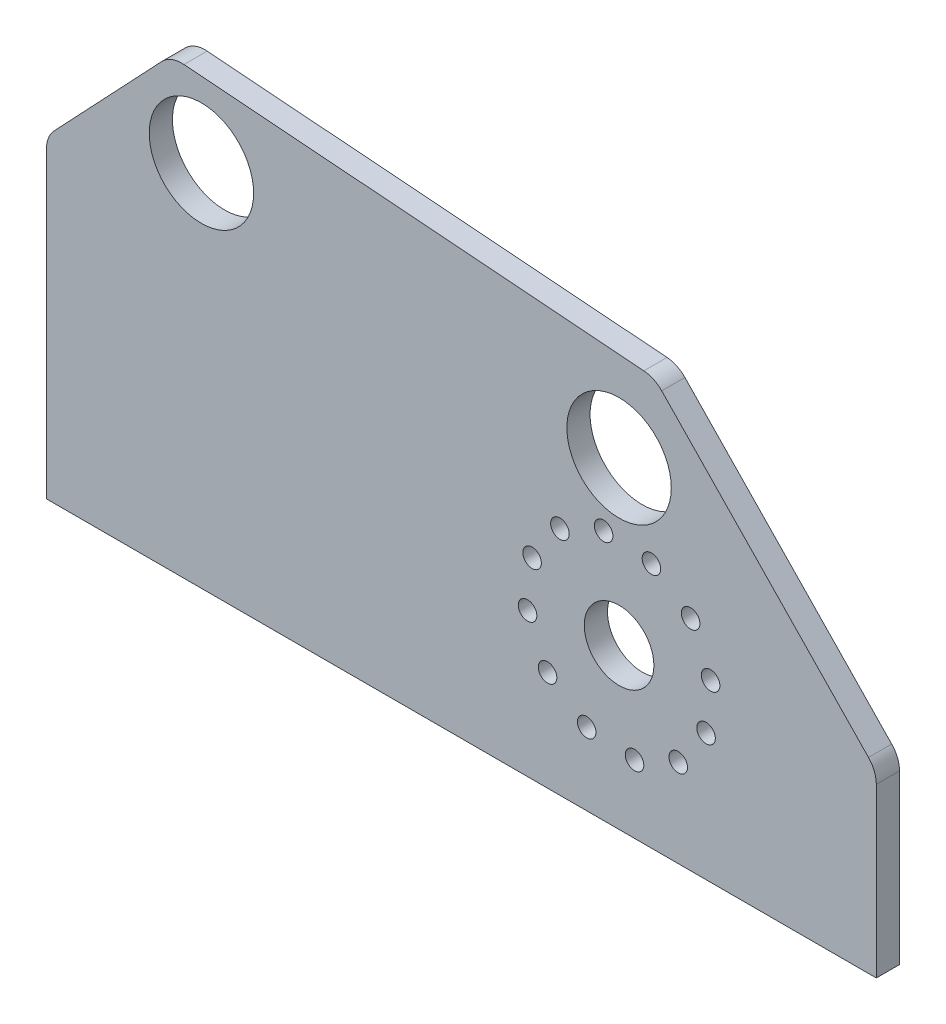
ISO-10303-21;
HEADER;
FILE_DESCRIPTION(('STEP AP214'),'2;1');
FILE_NAME('part.step','',(''),(''),'','','');
FILE_SCHEMA(('AUTOMOTIVE_DESIGN { 1 0 10303 214 1 1 1 1 }'));
ENDSEC;
DATA;
#1=APPLICATION_CONTEXT('core data for automotive mechanical design processes');
#2=APPLICATION_PROTOCOL_DEFINITION('international standard','automotive_design',2000,#1);
#3=PRODUCT_CONTEXT('',#1,'mechanical');
#4=PRODUCT('Part','Part','',(#3));
#5=PRODUCT_RELATED_PRODUCT_CATEGORY('part','',(#4));
#6=PRODUCT_DEFINITION_FORMATION('','',#4);
#7=PRODUCT_DEFINITION_CONTEXT('part definition',#1,'design');
#8=PRODUCT_DEFINITION('design','',#6,#7);
#9=PRODUCT_DEFINITION_SHAPE('','',#8);
#10=(LENGTH_UNIT() NAMED_UNIT(*) SI_UNIT(.MILLI.,.METRE.));
#11=(NAMED_UNIT(*) PLANE_ANGLE_UNIT() SI_UNIT($,.RADIAN.));
#12=(NAMED_UNIT(*) SI_UNIT($,.STERADIAN.) SOLID_ANGLE_UNIT());
#13=UNCERTAINTY_MEASURE_WITH_UNIT(LENGTH_MEASURE(1.E-05),#10,'distance_accuracy_value','');
#14=(GEOMETRIC_REPRESENTATION_CONTEXT(3) GLOBAL_UNCERTAINTY_ASSIGNED_CONTEXT((#13)) GLOBAL_UNIT_ASSIGNED_CONTEXT((#10,
#11,#12)) REPRESENTATION_CONTEXT('',''));
#15=CARTESIAN_POINT('',(0.,0.,0.));
#16=DIRECTION('',(0.,0.,1.));
#17=DIRECTION('',(1.,0.,0.));
#18=AXIS2_PLACEMENT_3D('',#15,#16,#17);
#19=CARTESIAN_POINT('',(-103.195672983194,204.440813465871,3.175));
#20=DIRECTION('',(0.,0.,-1.));
#21=DIRECTION('',(-1.,0.,0.));
#22=AXIS2_PLACEMENT_3D('',#19,#20,#21);
#23=CYLINDRICAL_SURFACE('',#22,2.54000000000001);
#24=CARTESIAN_POINT('',(-103.195672983194,204.440813465871,0.));
#25=DIRECTION('',(0.,0.,1.));
#26=DIRECTION('',(1.,0.,0.));
#27=AXIS2_PLACEMENT_3D('',#24,#25,#26);
#28=CIRCLE('',#27,2.54000000000001);
#29=CARTESIAN_POINT('',(-104.492793364608,202.256991422728,0.));
#30=VERTEX_POINT('',#29);
#31=CARTESIAN_POINT('',(-100.657320969105,204.532295991912,0.));
#32=VERTEX_POINT('',#31);
#33=EDGE_CURVE('E209',#30,#32,#28,.T.);
#34=ORIENTED_EDGE('',*,*,#33,.F.);
#35=DIRECTION('',(0.,0.,-1.));
#36=VECTOR('',#35,1.);
#37=CARTESIAN_POINT('',(-104.492793364608,202.256991422728,3.175));
#38=LINE('',#37,#36);
#39=CARTESIAN_POINT('',(-104.492793364608,202.256991422728,-3.175));
#40=VERTEX_POINT('',#39);
#41=EDGE_CURVE('E84',#30,#40,#38,.T.);
#42=ORIENTED_EDGE('',*,*,#41,.T.);
#43=CARTESIAN_POINT('',(-103.195672983194,204.440813465871,-3.175));
#44=DIRECTION('',(0.,0.,1.));
#45=DIRECTION('',(1.,0.,0.));
#46=AXIS2_PLACEMENT_3D('',#43,#44,#45);
#47=CIRCLE('',#46,2.54000000000001);
#48=CARTESIAN_POINT('',(-100.657320969105,204.532295991912,-3.175));
#49=VERTEX_POINT('',#48);
#50=EDGE_CURVE('E221',#40,#49,#47,.T.);
#51=ORIENTED_EDGE('',*,*,#50,.T.);
#52=DIRECTION('',(0.,0.,-1.));
#53=VECTOR('',#52,1.);
#54=CARTESIAN_POINT('',(-100.657320969105,204.532295991912,3.175));
#55=LINE('',#54,#53);
#56=EDGE_CURVE('E200',#32,#49,#55,.T.);
#57=ORIENTED_EDGE('',*,*,#56,.F.);
#58=EDGE_LOOP('',(#34,#42,#51,#57));
#59=FACE_BOUND('',#58,.T.);
#60=ADVANCED_FACE('F80',(#59),#23,.T.);
#61=CARTESIAN_POINT('',(0.,0.,3.175));
#62=DIRECTION('',(0.,0.,1.));
#63=DIRECTION('',(1.,0.,0.));
#64=AXIS2_PLACEMENT_3D('',#61,#62,#63);
#65=PLANE('',#64);
#66=CARTESIAN_POINT('',(-127.,198.12,3.175));
#67=DIRECTION('',(0.,0.,1.));
#68=DIRECTION('',(1.,0.,0.));
#69=AXIS2_PLACEMENT_3D('',#66,#67,#68);
#70=CIRCLE('',#69,9.52499999999999);
#71=CARTESIAN_POINT('',(-117.475,198.12,3.175));
#72=VERTEX_POINT('',#71);
#73=EDGE_CURVE('E305',#72,#72,#70,.T.);
#74=ORIENTED_EDGE('',*,*,#73,.F.);
#75=EDGE_LOOP('',(#74));
#76=FACE_BOUND('',#75,.T.);
#77=CARTESIAN_POINT('',(-118.139186534134,221.924327016808,3.175));
#78=DIRECTION('',(0.,0.,1.));
#79=DIRECTION('',(1.,0.,0.));
#80=AXIS2_PLACEMENT_3D('',#77,#78,#79);
#81=CIRCLE('',#80,2.54000000000006);
#82=CARTESIAN_POINT('',(-115.599186534134,221.924327016808,3.175));
#83=VERTEX_POINT('',#82);
#84=EDGE_CURVE('E356',#83,#83,#81,.T.);
#85=ORIENTED_EDGE('',*,*,#84,.F.);
#86=EDGE_LOOP('',(#85));
#87=FACE_BOUND('',#86,.T.);
#88=CARTESIAN_POINT('',(-107.424146931961,214.304745183615,3.175));
#89=DIRECTION('',(0.,0.,1.));
#90=DIRECTION('',(1.,0.,0.));
#91=AXIS2_PLACEMENT_3D('',#88,#89,#90);
#92=CIRCLE('',#91,2.54000000000001);
#93=CARTESIAN_POINT('',(-104.884146931961,214.304745183615,3.175));
#94=VERTEX_POINT('',#93);
#95=EDGE_CURVE('E348',#94,#94,#92,.T.);
#96=ORIENTED_EDGE('',*,*,#95,.F.);
#97=EDGE_LOOP('',(#96));
#98=FACE_BOUND('',#97,.T.);
#99=CARTESIAN_POINT('',(-103.195672983192,189.259186534134,3.175));
#100=DIRECTION('',(0.,0.,1.));
#101=DIRECTION('',(1.,0.,0.));
#102=AXIS2_PLACEMENT_3D('',#99,#100,#101);
#103=CIRCLE('',#102,2.54000000000001);
#104=CARTESIAN_POINT('',(-100.655672983192,189.259186534134,3.175));
#105=VERTEX_POINT('',#104);
#106=EDGE_CURVE('E347',#105,#105,#103,.T.);
#107=ORIENTED_EDGE('',*,*,#106,.F.);
#108=EDGE_LOOP('',(#107));
#109=FACE_BOUND('',#108,.T.);
#110=CARTESIAN_POINT('',(-110.815254816385,178.544146931961,3.175));
#111=DIRECTION('',(0.,0.,1.));
#112=DIRECTION('',(1.,0.,0.));
#113=AXIS2_PLACEMENT_3D('',#110,#111,#112);
#114=CIRCLE('',#113,2.53999999999998);
#115=CARTESIAN_POINT('',(-108.275254816385,178.544146931961,3.175));
#116=VERTEX_POINT('',#115);
#117=EDGE_CURVE('E353',#116,#116,#114,.T.);
#118=ORIENTED_EDGE('',*,*,#117,.F.);
#119=EDGE_LOOP('',(#118));
#120=FACE_BOUND('',#119,.T.);
#121=CARTESIAN_POINT('',(-122.771526051231,173.074441350519,3.175));
#122=DIRECTION('',(0.,0.,1.));
#123=DIRECTION('',(1.,0.,0.));
#124=AXIS2_PLACEMENT_3D('',#121,#122,#123);
#125=CIRCLE('',#124,2.53999999999998);
#126=CARTESIAN_POINT('',(-120.231526051231,173.074441350519,3.175));
#127=VERTEX_POINT('',#126);
#128=EDGE_CURVE('E363',#127,#127,#125,.T.);
#129=ORIENTED_EDGE('',*,*,#128,.F.);
#130=EDGE_LOOP('',(#129));
#131=FACE_BOUND('',#130,.T.);
#132=CARTESIAN_POINT('',(-241.3,255.27,3.175));
#133=DIRECTION('',(0.,0.,1.));
#134=DIRECTION('',(1.,0.,0.));
#135=AXIS2_PLACEMENT_3D('',#132,#133,#134);
#136=CIRCLE('',#135,14.2875);
#137=CARTESIAN_POINT('',(-227.0125,255.27,3.175));
#138=VERTEX_POINT('',#137);
#139=EDGE_CURVE('E367',#138,#138,#136,.T.);
#140=ORIENTED_EDGE('',*,*,#139,.F.);
#141=EDGE_LOOP('',(#140));
#142=FACE_BOUND('',#141,.T.);
#143=CARTESIAN_POINT('',(-127.,242.57,3.175));
#144=DIRECTION('',(0.,0.,1.));
#145=DIRECTION('',(1.,0.,0.));
#146=AXIS2_PLACEMENT_3D('',#143,#144,#145);
#147=CIRCLE('',#146,14.2875);
#148=CARTESIAN_POINT('',(-112.7125,242.57,3.175));
#149=VERTEX_POINT('',#148);
#150=EDGE_CURVE('E371',#149,#149,#147,.T.);
#151=ORIENTED_EDGE('',*,*,#150,.F.);
#152=EDGE_LOOP('',(#151));
#153=FACE_BOUND('',#152,.T.);
#154=CARTESIAN_POINT('',(-135.860813465866,174.315672983192,3.175));
#155=DIRECTION('',(0.,0.,1.));
#156=DIRECTION('',(1.,0.,0.));
#157=AXIS2_PLACEMENT_3D('',#154,#155,#156);
#158=CIRCLE('',#157,2.54000000000001);
#159=CARTESIAN_POINT('',(-133.320813465866,174.315672983192,3.175));
#160=VERTEX_POINT('',#159);
#161=EDGE_CURVE('E375',#160,#160,#158,.T.);
#162=ORIENTED_EDGE('',*,*,#161,.F.);
#163=EDGE_LOOP('',(#162));
#164=FACE_BOUND('',#163,.T.);
#165=CARTESIAN_POINT('',(-146.575853068039,181.935254816385,3.175));
#166=DIRECTION('',(0.,0.,1.));
#167=DIRECTION('',(1.,0.,0.));
#168=AXIS2_PLACEMENT_3D('',#165,#166,#167);
#169=CIRCLE('',#168,2.53999999999998);
#170=CARTESIAN_POINT('',(-144.035853068039,181.935254816385,3.175));
#171=VERTEX_POINT('',#170);
#172=EDGE_CURVE('E379',#171,#171,#169,.T.);
#173=ORIENTED_EDGE('',*,*,#172,.F.);
#174=EDGE_LOOP('',(#173));
#175=FACE_BOUND('',#174,.T.);
#176=CARTESIAN_POINT('',(-152.045558649481,193.891526051231,3.175));
#177=DIRECTION('',(0.,0.,1.));
#178=DIRECTION('',(1.,0.,0.));
#179=AXIS2_PLACEMENT_3D('',#176,#177,#178);
#180=CIRCLE('',#179,2.54000000000001);
#181=CARTESIAN_POINT('',(-149.505558649481,193.891526051231,3.175));
#182=VERTEX_POINT('',#181);
#183=EDGE_CURVE('E383',#182,#182,#180,.T.);
#184=ORIENTED_EDGE('',*,*,#183,.F.);
#185=EDGE_LOOP('',(#184));
#186=FACE_BOUND('',#185,.T.);
#187=CARTESIAN_POINT('',(-150.804327016808,206.980813465866,3.175));
#188=DIRECTION('',(0.,0.,1.));
#189=DIRECTION('',(1.,0.,0.));
#190=AXIS2_PLACEMENT_3D('',#187,#188,#189);
#191=CIRCLE('',#190,2.53999999999998);
#192=CARTESIAN_POINT('',(-148.264327016808,206.980813465866,3.175));
#193=VERTEX_POINT('',#192);
#194=EDGE_CURVE('E387',#193,#193,#191,.T.);
#195=ORIENTED_EDGE('',*,*,#194,.F.);
#196=EDGE_LOOP('',(#195));
#197=FACE_BOUND('',#196,.T.);
#198=CARTESIAN_POINT('',(-143.184745183615,217.695853068039,3.175));
#199=DIRECTION('',(0.,0.,1.));
#200=DIRECTION('',(1.,0.,0.));
#201=AXIS2_PLACEMENT_3D('',#198,#199,#200);
#202=CIRCLE('',#201,2.53999999999998);
#203=CARTESIAN_POINT('',(-140.644745183615,217.695853068039,3.175));
#204=VERTEX_POINT('',#203);
#205=EDGE_CURVE('E391',#204,#204,#202,.T.);
#206=ORIENTED_EDGE('',*,*,#205,.F.);
#207=EDGE_LOOP('',(#206));
#208=FACE_BOUND('',#207,.T.);
#209=CARTESIAN_POINT('',(-131.228473948769,223.165558649481,3.175));
#210=DIRECTION('',(0.,0.,1.));
#211=DIRECTION('',(1.,0.,0.));
#212=AXIS2_PLACEMENT_3D('',#209,#210,#211);
#213=CIRCLE('',#212,2.54000000000001);
#214=CARTESIAN_POINT('',(-128.688473948769,223.165558649481,3.175));
#215=VERTEX_POINT('',#214);
#216=EDGE_CURVE('E395',#215,#215,#213,.T.);
#217=ORIENTED_EDGE('',*,*,#216,.F.);
#218=EDGE_LOOP('',(#217));
#219=FACE_BOUND('',#218,.T.);
#220=DIRECTION('',(0.,-1.,0.));
#221=VECTOR('',#220,1.);
#222=CARTESIAN_POINT('',(-56.6052196507486,0.,3.175));
#223=LINE('',#222,#221);
#224=CARTESIAN_POINT('',(-56.6052196507486,200.39998243696,3.175));
#225=VERTEX_POINT('',#224);
#226=CARTESIAN_POINT('',(-56.6052196507486,154.488890978673,3.175));
#227=VERTEX_POINT('',#226);
#228=EDGE_CURVE('E399',#225,#227,#223,.T.);
#229=ORIENTED_EDGE('',*,*,#228,.F.);
#230=CARTESIAN_POINT('',(-64.2252196507486,200.39998243696,3.175));
#231=DIRECTION('',(0.,0.,1.));
#232=DIRECTION('',(1.,0.,0.));
#233=AXIS2_PLACEMENT_3D('',#230,#231,#232);
#234=CIRCLE('',#233,7.62000000000002);
#235=CARTESIAN_POINT('',(-58.7443216503223,205.6937671992,3.175));
#236=VERTEX_POINT('',#235);
#237=EDGE_CURVE('E402',#225,#236,#234,.T.);
#238=ORIENTED_EDGE('',*,*,#237,.T.);
#239=DIRECTION('',(0.694722409742759,-0.719277952811856,0.));
#240=VECTOR('',#239,1.);
#241=CARTESIAN_POINT('',(72.3928618493464,69.9214305617787,3.175));
#242=LINE('',#241,#240);
#243=CARTESIAN_POINT('',(-115.329485400629,264.27898076229,3.175));
#244=VERTEX_POINT('',#243);
#245=EDGE_CURVE('E405',#244,#236,#242,.T.);
#246=ORIENTED_EDGE('',*,*,#245,.F.);
#247=CARTESIAN_POINT('',(-120.810383401055,258.985196000051,3.175));
#248=DIRECTION('',(0.,0.,1.));
#249=DIRECTION('',(1.,0.,0.));
#250=AXIS2_PLACEMENT_3D('',#247,#248,#249);
#251=CIRCLE('',#250,7.61999999999996);
#252=CARTESIAN_POINT('',(-120.226343784635,266.58278099309,3.175));
#253=VERTEX_POINT('',#252);
#254=EDGE_CURVE('E409',#244,#253,#251,.T.);
#255=ORIENTED_EDGE('',*,*,#254,.T.);
#256=DIRECTION('',(0.99705839803661,-0.0766456189528719,0.));
#257=VECTOR('',#256,1.);
#258=CARTESIAN_POINT('',(19.6660224801687,255.829010682081,3.175));
#259=LINE('',#258,#257);
#260=CARTESIAN_POINT('',(-246.064861075341,276.256207409085,3.175));
#261=VERTEX_POINT('',#260);
#262=EDGE_CURVE('E412',#261,#253,#259,.T.);
#263=ORIENTED_EDGE('',*,*,#262,.F.);
#264=CARTESIAN_POINT('',(-246.648900691762,268.658622416047,3.175));
#265=DIRECTION('',(0.,0.,1.));
#266=DIRECTION('',(1.,0.,0.));
#267=AXIS2_PLACEMENT_3D('',#264,#265,#266);
#268=CIRCLE('',#267,7.61999999999996);
#269=CARTESIAN_POINT('',(-252.186796021744,273.892752268674,3.175));
#270=VERTEX_POINT('',#269);
#271=EDGE_CURVE('E416',#261,#270,#268,.T.);
#272=ORIENTED_EDGE('',*,*,#271,.T.);
#273=DIRECTION('',(0.686893681447124,0.72675791732049,0.));
#274=VECTOR('',#273,1.);
#275=CARTESIAN_POINT('',(-269.928029914058,255.121896541613,3.175));
#276=LINE('',#275,#274);
#277=CARTESIAN_POINT('',(-281.613376670001,242.758384544203,3.175));
#278=VERTEX_POINT('',#277);
#279=EDGE_CURVE('E181',#278,#270,#276,.T.);
#280=ORIENTED_EDGE('',*,*,#279,.F.);
#281=CARTESIAN_POINT('',(-276.075481340018,237.524254691576,3.175));
#282=DIRECTION('',(0.,0.,1.));
#283=DIRECTION('',(1.,0.,0.));
#284=AXIS2_PLACEMENT_3D('',#281,#282,#283);
#285=CIRCLE('',#284,7.62);
#286=CARTESIAN_POINT('',(-283.695481340018,237.524254691576,3.175));
#287=VERTEX_POINT('',#286);
#288=EDGE_CURVE('E172',#278,#287,#285,.T.);
#289=ORIENTED_EDGE('',*,*,#288,.T.);
#290=DIRECTION('',(0.,1.,0.));
#291=VECTOR('',#290,1.);
#292=CARTESIAN_POINT('',(-283.695481340018,0.,3.175));
#293=LINE('',#292,#291);
#294=CARTESIAN_POINT('',(-283.695481340018,154.488890978673,3.175));
#295=VERTEX_POINT('',#294);
#296=EDGE_CURVE('E179',#295,#287,#293,.T.);
#297=ORIENTED_EDGE('',*,*,#296,.F.);
#298=DIRECTION('',(-1.,0.,0.));
#299=VECTOR('',#298,1.);
#300=CARTESIAN_POINT('',(0.,154.488890978673,3.175));
#301=LINE('',#300,#299);
#302=EDGE_CURVE('E197',#227,#295,#301,.T.);
#303=ORIENTED_EDGE('',*,*,#302,.F.);
#304=EDGE_LOOP('',(#229,#238,#246,#255,#263,#272,#280,#289,#297,#303));
#305=FACE_BOUND('',#304,.T.);
#306=CARTESIAN_POINT('',(-101.954441350519,202.348473948769,3.175));
#307=DIRECTION('',(0.,0.,1.));
#308=DIRECTION('',(1.,0.,0.));
#309=AXIS2_PLACEMENT_3D('',#306,#307,#308);
#310=CIRCLE('',#309,2.54000000000001);
#311=CARTESIAN_POINT('',(-99.4144413505192,202.348473948769,3.175));
#312=VERTEX_POINT('',#311);
#313=EDGE_CURVE('E345',#312,#312,#310,.T.);
#314=ORIENTED_EDGE('',*,*,#313,.F.);
#315=EDGE_LOOP('',(#314));
#316=FACE_BOUND('',#315,.T.);
#317=ADVANCED_FACE('F175',(#76,#87,#98,#109,#120,#131,#142,#153,#164,#175,#186,#197,#208,#219,
#305,#316),#65,.T.);
#318=CARTESIAN_POINT('',(0.,0.,-3.175));
#319=DIRECTION('',(0.,0.,1.));
#320=DIRECTION('',(1.,0.,0.));
#321=AXIS2_PLACEMENT_3D('',#318,#319,#320);
#322=PLANE('',#321);
#323=ORIENTED_EDGE('',*,*,#50,.F.);
#324=CARTESIAN_POINT('',(-101.954441350519,202.348473948769,-3.175));
#325=DIRECTION('',(0.,0.,1.));
#326=DIRECTION('',(1.,0.,0.));
#327=AXIS2_PLACEMENT_3D('',#324,#325,#326);
#328=CIRCLE('',#327,2.54000000000001);
#329=EDGE_CURVE('E217',#40,#49,#328,.T.);
#330=ORIENTED_EDGE('',*,*,#329,.T.);
#331=EDGE_LOOP('',(#323,#330));
#332=FACE_BOUND('',#331,.T.);
#333=DIRECTION('',(0.,-1.,0.));
#334=VECTOR('',#333,1.);
#335=CARTESIAN_POINT('',(-56.6052196507486,0.,-3.175));
#336=LINE('',#335,#334);
#337=CARTESIAN_POINT('',(-56.6052196507486,200.39998243696,-3.175));
#338=VERTEX_POINT('',#337);
#339=CARTESIAN_POINT('',(-56.6052196507486,154.488890978673,-3.175));
#340=VERTEX_POINT('',#339);
#341=EDGE_CURVE('E269',#338,#340,#336,.T.);
#342=ORIENTED_EDGE('',*,*,#341,.T.);
#343=DIRECTION('',(-1.,0.,0.));
#344=VECTOR('',#343,1.);
#345=CARTESIAN_POINT('',(0.,154.488890978673,-3.175));
#346=LINE('',#345,#344);
#347=CARTESIAN_POINT('',(-283.695481340018,154.488890978673,-3.175));
#348=VERTEX_POINT('',#347);
#349=EDGE_CURVE('E301',#340,#348,#346,.T.);
#350=ORIENTED_EDGE('',*,*,#349,.T.);
#351=DIRECTION('',(0.,1.,0.));
#352=VECTOR('',#351,1.);
#353=CARTESIAN_POINT('',(-283.695481340018,0.,-3.175));
#354=LINE('',#353,#352);
#355=CARTESIAN_POINT('',(-283.695481340018,237.524254691576,-3.175));
#356=VERTEX_POINT('',#355);
#357=EDGE_CURVE('E298',#348,#356,#354,.T.);
#358=ORIENTED_EDGE('',*,*,#357,.T.);
#359=CARTESIAN_POINT('',(-276.075481340018,237.524254691576,-3.175));
#360=DIRECTION('',(0.,0.,1.));
#361=DIRECTION('',(1.,0.,0.));
#362=AXIS2_PLACEMENT_3D('',#359,#360,#361);
#363=CIRCLE('',#362,7.62);
#364=CARTESIAN_POINT('',(-281.613376670001,242.758384544203,-3.175));
#365=VERTEX_POINT('',#364);
#366=EDGE_CURVE('E189',#365,#356,#363,.T.);
#367=ORIENTED_EDGE('',*,*,#366,.F.);
#368=DIRECTION('',(0.686893681447124,0.72675791732049,0.));
#369=VECTOR('',#368,1.);
#370=CARTESIAN_POINT('',(-269.928029914058,255.121896541613,-3.175));
#371=LINE('',#370,#369);
#372=CARTESIAN_POINT('',(-252.186796021744,273.892752268674,-3.175));
#373=VERTEX_POINT('',#372);
#374=EDGE_CURVE('E292',#365,#373,#371,.T.);
#375=ORIENTED_EDGE('',*,*,#374,.T.);
#376=CARTESIAN_POINT('',(-246.648900691762,268.658622416047,-3.175));
#377=DIRECTION('',(0.,0.,1.));
#378=DIRECTION('',(1.,0.,0.));
#379=AXIS2_PLACEMENT_3D('',#376,#377,#378);
#380=CIRCLE('',#379,7.61999999999996);
#381=CARTESIAN_POINT('',(-246.064861075341,276.256207409085,-3.175));
#382=VERTEX_POINT('',#381);
#383=EDGE_CURVE('E288',#382,#373,#380,.T.);
#384=ORIENTED_EDGE('',*,*,#383,.F.);
#385=DIRECTION('',(0.99705839803661,-0.0766456189528719,0.));
#386=VECTOR('',#385,1.);
#387=CARTESIAN_POINT('',(19.6660224801687,255.829010682081,-3.175));
#388=LINE('',#387,#386);
#389=CARTESIAN_POINT('',(-120.226343784635,266.58278099309,-3.175));
#390=VERTEX_POINT('',#389);
#391=EDGE_CURVE('E284',#382,#390,#388,.T.);
#392=ORIENTED_EDGE('',*,*,#391,.T.);
#393=CARTESIAN_POINT('',(-120.810383401055,258.985196000051,-3.175));
#394=DIRECTION('',(0.,0.,1.));
#395=DIRECTION('',(1.,0.,0.));
#396=AXIS2_PLACEMENT_3D('',#393,#394,#395);
#397=CIRCLE('',#396,7.61999999999996);
#398=CARTESIAN_POINT('',(-115.329485400629,264.27898076229,-3.175));
#399=VERTEX_POINT('',#398);
#400=EDGE_CURVE('E280',#399,#390,#397,.T.);
#401=ORIENTED_EDGE('',*,*,#400,.F.);
#402=DIRECTION('',(0.694722409742759,-0.719277952811856,0.));
#403=VECTOR('',#402,1.);
#404=CARTESIAN_POINT('',(72.3928618493464,69.9214305617787,-3.175));
#405=LINE('',#404,#403);
#406=CARTESIAN_POINT('',(-58.7443216503223,205.6937671992,-3.175));
#407=VERTEX_POINT('',#406);
#408=EDGE_CURVE('E276',#399,#407,#405,.T.);
#409=ORIENTED_EDGE('',*,*,#408,.T.);
#410=CARTESIAN_POINT('',(-64.2252196507486,200.39998243696,-3.175));
#411=DIRECTION('',(0.,0.,1.));
#412=DIRECTION('',(1.,0.,0.));
#413=AXIS2_PLACEMENT_3D('',#410,#411,#412);
#414=CIRCLE('',#413,7.62000000000002);
#415=EDGE_CURVE('E272',#338,#407,#414,.T.);
#416=ORIENTED_EDGE('',*,*,#415,.F.);
#417=EDGE_LOOP('',(#342,#350,#358,#367,#375,#384,#392,#401,#409,#416));
#418=FACE_BOUND('',#417,.T.);
#419=CARTESIAN_POINT('',(-131.228473948769,223.165558649481,-3.175));
#420=DIRECTION('',(0.,0.,1.));
#421=DIRECTION('',(1.,0.,0.));
#422=AXIS2_PLACEMENT_3D('',#419,#420,#421);
#423=CIRCLE('',#422,2.54000000000001);
#424=CARTESIAN_POINT('',(-128.688473948769,223.165558649481,-3.175));
#425=VERTEX_POINT('',#424);
#426=EDGE_CURVE('E265',#425,#425,#423,.T.);
#427=ORIENTED_EDGE('',*,*,#426,.T.);
#428=EDGE_LOOP('',(#427));
#429=FACE_BOUND('',#428,.T.);
#430=CARTESIAN_POINT('',(-143.184745183615,217.695853068039,-3.175));
#431=DIRECTION('',(0.,0.,1.));
#432=DIRECTION('',(1.,0.,0.));
#433=AXIS2_PLACEMENT_3D('',#430,#431,#432);
#434=CIRCLE('',#433,2.53999999999998);
#435=CARTESIAN_POINT('',(-140.644745183615,217.695853068039,-3.175));
#436=VERTEX_POINT('',#435);
#437=EDGE_CURVE('E261',#436,#436,#434,.T.);
#438=ORIENTED_EDGE('',*,*,#437,.T.);
#439=EDGE_LOOP('',(#438));
#440=FACE_BOUND('',#439,.T.);
#441=CARTESIAN_POINT('',(-150.804327016808,206.980813465866,-3.175));
#442=DIRECTION('',(0.,0.,1.));
#443=DIRECTION('',(1.,0.,0.));
#444=AXIS2_PLACEMENT_3D('',#441,#442,#443);
#445=CIRCLE('',#444,2.53999999999998);
#446=CARTESIAN_POINT('',(-148.264327016808,206.980813465866,-3.175));
#447=VERTEX_POINT('',#446);
#448=EDGE_CURVE('E257',#447,#447,#445,.T.);
#449=ORIENTED_EDGE('',*,*,#448,.T.);
#450=EDGE_LOOP('',(#449));
#451=FACE_BOUND('',#450,.T.);
#452=CARTESIAN_POINT('',(-152.045558649481,193.891526051231,-3.175));
#453=DIRECTION('',(0.,0.,1.));
#454=DIRECTION('',(1.,0.,0.));
#455=AXIS2_PLACEMENT_3D('',#452,#453,#454);
#456=CIRCLE('',#455,2.54000000000001);
#457=CARTESIAN_POINT('',(-149.505558649481,193.891526051231,-3.175));
#458=VERTEX_POINT('',#457);
#459=EDGE_CURVE('E253',#458,#458,#456,.T.);
#460=ORIENTED_EDGE('',*,*,#459,.T.);
#461=EDGE_LOOP('',(#460));
#462=FACE_BOUND('',#461,.T.);
#463=CARTESIAN_POINT('',(-146.575853068039,181.935254816385,-3.175));
#464=DIRECTION('',(0.,0.,1.));
#465=DIRECTION('',(1.,0.,0.));
#466=AXIS2_PLACEMENT_3D('',#463,#464,#465);
#467=CIRCLE('',#466,2.53999999999998);
#468=CARTESIAN_POINT('',(-144.035853068039,181.935254816385,-3.175));
#469=VERTEX_POINT('',#468);
#470=EDGE_CURVE('E249',#469,#469,#467,.T.);
#471=ORIENTED_EDGE('',*,*,#470,.T.);
#472=EDGE_LOOP('',(#471));
#473=FACE_BOUND('',#472,.T.);
#474=CARTESIAN_POINT('',(-135.860813465866,174.315672983192,-3.175));
#475=DIRECTION('',(0.,0.,1.));
#476=DIRECTION('',(1.,0.,0.));
#477=AXIS2_PLACEMENT_3D('',#474,#475,#476);
#478=CIRCLE('',#477,2.54000000000001);
#479=CARTESIAN_POINT('',(-133.320813465866,174.315672983192,-3.175));
#480=VERTEX_POINT('',#479);
#481=EDGE_CURVE('E245',#480,#480,#478,.T.);
#482=ORIENTED_EDGE('',*,*,#481,.T.);
#483=EDGE_LOOP('',(#482));
#484=FACE_BOUND('',#483,.T.);
#485=CARTESIAN_POINT('',(-127.,242.57,-3.175));
#486=DIRECTION('',(0.,0.,1.));
#487=DIRECTION('',(1.,0.,0.));
#488=AXIS2_PLACEMENT_3D('',#485,#486,#487);
#489=CIRCLE('',#488,14.2875);
#490=CARTESIAN_POINT('',(-112.7125,242.57,-3.175));
#491=VERTEX_POINT('',#490);
#492=EDGE_CURVE('E241',#491,#491,#489,.T.);
#493=ORIENTED_EDGE('',*,*,#492,.T.);
#494=EDGE_LOOP('',(#493));
#495=FACE_BOUND('',#494,.T.);
#496=CARTESIAN_POINT('',(-241.3,255.27,-3.175));
#497=DIRECTION('',(0.,0.,1.));
#498=DIRECTION('',(1.,0.,0.));
#499=AXIS2_PLACEMENT_3D('',#496,#497,#498);
#500=CIRCLE('',#499,14.2875);
#501=CARTESIAN_POINT('',(-227.0125,255.27,-3.175));
#502=VERTEX_POINT('',#501);
#503=EDGE_CURVE('E237',#502,#502,#500,.T.);
#504=ORIENTED_EDGE('',*,*,#503,.T.);
#505=EDGE_LOOP('',(#504));
#506=FACE_BOUND('',#505,.T.);
#507=CARTESIAN_POINT('',(-122.771526051231,173.074441350519,-3.175));
#508=DIRECTION('',(0.,0.,1.));
#509=DIRECTION('',(1.,0.,0.));
#510=AXIS2_PLACEMENT_3D('',#507,#508,#509);
#511=CIRCLE('',#510,2.53999999999998);
#512=CARTESIAN_POINT('',(-120.231526051231,173.074441350519,-3.175));
#513=VERTEX_POINT('',#512);
#514=EDGE_CURVE('E233',#513,#513,#511,.T.);
#515=ORIENTED_EDGE('',*,*,#514,.T.);
#516=EDGE_LOOP('',(#515));
#517=FACE_BOUND('',#516,.T.);
#518=CARTESIAN_POINT('',(-110.815254816385,178.544146931961,-3.175));
#519=DIRECTION('',(0.,0.,1.));
#520=DIRECTION('',(1.,0.,0.));
#521=AXIS2_PLACEMENT_3D('',#518,#519,#520);
#522=CIRCLE('',#521,2.53999999999998);
#523=CARTESIAN_POINT('',(-108.275254816385,178.544146931961,-3.175));
#524=VERTEX_POINT('',#523);
#525=EDGE_CURVE('E229',#524,#524,#522,.T.);
#526=ORIENTED_EDGE('',*,*,#525,.T.);
#527=EDGE_LOOP('',(#526));
#528=FACE_BOUND('',#527,.T.);
#529=CARTESIAN_POINT('',(-103.195672983192,189.259186534134,-3.175));
#530=DIRECTION('',(0.,0.,1.));
#531=DIRECTION('',(1.,0.,0.));
#532=AXIS2_PLACEMENT_3D('',#529,#530,#531);
#533=CIRCLE('',#532,2.54000000000001);
#534=CARTESIAN_POINT('',(-100.655672983192,189.259186534134,-3.175));
#535=VERTEX_POINT('',#534);
#536=EDGE_CURVE('E225',#535,#535,#533,.T.);
#537=ORIENTED_EDGE('',*,*,#536,.T.);
#538=EDGE_LOOP('',(#537));
#539=FACE_BOUND('',#538,.T.);
#540=CARTESIAN_POINT('',(-107.424146931961,214.304745183615,-3.175));
#541=DIRECTION('',(0.,0.,1.));
#542=DIRECTION('',(1.,0.,0.));
#543=AXIS2_PLACEMENT_3D('',#540,#541,#542);
#544=CIRCLE('',#543,2.54000000000001);
#545=CARTESIAN_POINT('',(-104.884146931961,214.304745183615,-3.175));
#546=VERTEX_POINT('',#545);
#547=EDGE_CURVE('E213',#546,#546,#544,.T.);
#548=ORIENTED_EDGE('',*,*,#547,.T.);
#549=EDGE_LOOP('',(#548));
#550=FACE_BOUND('',#549,.T.);
#551=CARTESIAN_POINT('',(-118.139186534134,221.924327016808,-3.175));
#552=DIRECTION('',(0.,0.,1.));
#553=DIRECTION('',(1.,0.,0.));
#554=AXIS2_PLACEMENT_3D('',#551,#552,#553);
#555=CIRCLE('',#554,2.54000000000006);
#556=CARTESIAN_POINT('',(-115.599186534134,221.924327016808,-3.175));
#557=VERTEX_POINT('',#556);
#558=EDGE_CURVE('E208',#557,#557,#555,.T.);
#559=ORIENTED_EDGE('',*,*,#558,.T.);
#560=EDGE_LOOP('',(#559));
#561=FACE_BOUND('',#560,.T.);
#562=CARTESIAN_POINT('',(-127.,198.12,-3.175));
#563=DIRECTION('',(0.,0.,1.));
#564=DIRECTION('',(1.,0.,0.));
#565=AXIS2_PLACEMENT_3D('',#562,#563,#564);
#566=CIRCLE('',#565,9.52499999999999);
#567=CARTESIAN_POINT('',(-117.475,198.12,-3.175));
#568=VERTEX_POINT('',#567);
#569=EDGE_CURVE('E204',#568,#568,#566,.T.);
#570=ORIENTED_EDGE('',*,*,#569,.T.);
#571=EDGE_LOOP('',(#570));
#572=FACE_BOUND('',#571,.T.);
#573=ADVANCED_FACE('F337',(#332,#418,#429,#440,#451,#462,#473,#484,#495,#506,#517,#528,#539,
#550,#561,#572),#322,.F.);
#574=CARTESIAN_POINT('',(-101.954441350519,202.348473948769,3.175));
#575=DIRECTION('',(0.,0.,-1.));
#576=DIRECTION('',(-1.,0.,0.));
#577=AXIS2_PLACEMENT_3D('',#574,#575,#576);
#578=CYLINDRICAL_SURFACE('',#577,2.54000000000001);
#579=ORIENTED_EDGE('',*,*,#41,.F.);
#580=CARTESIAN_POINT('',(-101.954441350519,202.348473948769,0.));
#581=DIRECTION('',(0.,0.,1.));
#582=DIRECTION('',(1.,0.,0.));
#583=AXIS2_PLACEMENT_3D('',#580,#581,#582);
#584=CIRCLE('',#583,2.54000000000001);
#585=EDGE_CURVE('E477',#32,#30,#584,.T.);
#586=ORIENTED_EDGE('',*,*,#585,.F.);
#587=ORIENTED_EDGE('',*,*,#56,.T.);
#588=ORIENTED_EDGE('',*,*,#329,.F.);
#589=EDGE_LOOP('',(#579,#586,#587,#588));
#590=FACE_BOUND('',#589,.T.);
#591=ORIENTED_EDGE('',*,*,#313,.T.);
#592=EDGE_LOOP('',(#591));
#593=FACE_BOUND('',#592,.T.);
#594=ADVANCED_FACE('F339',(#590,#593),#578,.F.);
#595=CARTESIAN_POINT('',(-127.,198.12,3.175));
#596=DIRECTION('',(0.,0.,-1.));
#597=DIRECTION('',(-1.,0.,0.));
#598=AXIS2_PLACEMENT_3D('',#595,#596,#597);
#599=CYLINDRICAL_SURFACE('',#598,9.52499999999999);
#600=ORIENTED_EDGE('',*,*,#73,.T.);
#601=EDGE_LOOP('',(#600));
#602=FACE_BOUND('',#601,.T.);
#603=ORIENTED_EDGE('',*,*,#569,.F.);
#604=EDGE_LOOP('',(#603));
#605=FACE_BOUND('',#604,.T.);
#606=ADVANCED_FACE('F82',(#602,#605),#599,.F.);
#607=CARTESIAN_POINT('',(-118.139186534134,221.924327016808,3.175));
#608=DIRECTION('',(0.,0.,-1.));
#609=DIRECTION('',(-1.,0.,0.));
#610=AXIS2_PLACEMENT_3D('',#607,#608,#609);
#611=CYLINDRICAL_SURFACE('',#610,2.54000000000006);
#612=ORIENTED_EDGE('',*,*,#84,.T.);
#613=EDGE_LOOP('',(#612));
#614=FACE_BOUND('',#613,.T.);
#615=ORIENTED_EDGE('',*,*,#558,.F.);
#616=EDGE_LOOP('',(#615));
#617=FACE_BOUND('',#616,.T.);
#618=ADVANCED_FACE('F451',(#614,#617),#611,.F.);
#619=CARTESIAN_POINT('',(-107.424146931961,214.304745183615,3.175));
#620=DIRECTION('',(0.,0.,-1.));
#621=DIRECTION('',(-1.,0.,0.));
#622=AXIS2_PLACEMENT_3D('',#619,#620,#621);
#623=CYLINDRICAL_SURFACE('',#622,2.54000000000001);
#624=ORIENTED_EDGE('',*,*,#95,.T.);
#625=EDGE_LOOP('',(#624));
#626=FACE_BOUND('',#625,.T.);
#627=ORIENTED_EDGE('',*,*,#547,.F.);
#628=EDGE_LOOP('',(#627));
#629=FACE_BOUND('',#628,.T.);
#630=ADVANCED_FACE('F449',(#626,#629),#623,.F.);
#631=CARTESIAN_POINT('',(-103.195672983192,189.259186534134,3.175));
#632=DIRECTION('',(0.,0.,-1.));
#633=DIRECTION('',(-1.,0.,0.));
#634=AXIS2_PLACEMENT_3D('',#631,#632,#633);
#635=CYLINDRICAL_SURFACE('',#634,2.54000000000001);
#636=ORIENTED_EDGE('',*,*,#106,.T.);
#637=EDGE_LOOP('',(#636));
#638=FACE_BOUND('',#637,.T.);
#639=ORIENTED_EDGE('',*,*,#536,.F.);
#640=EDGE_LOOP('',(#639));
#641=FACE_BOUND('',#640,.T.);
#642=ADVANCED_FACE('F446',(#638,#641),#635,.F.);
#643=CARTESIAN_POINT('',(-110.815254816385,178.544146931961,3.175));
#644=DIRECTION('',(0.,0.,-1.));
#645=DIRECTION('',(-1.,0.,0.));
#646=AXIS2_PLACEMENT_3D('',#643,#644,#645);
#647=CYLINDRICAL_SURFACE('',#646,2.53999999999998);
#648=ORIENTED_EDGE('',*,*,#117,.T.);
#649=EDGE_LOOP('',(#648));
#650=FACE_BOUND('',#649,.T.);
#651=ORIENTED_EDGE('',*,*,#525,.F.);
#652=EDGE_LOOP('',(#651));
#653=FACE_BOUND('',#652,.T.);
#654=ADVANCED_FACE('F545',(#650,#653),#647,.F.);
#655=CARTESIAN_POINT('',(-122.771526051231,173.074441350519,3.175));
#656=DIRECTION('',(0.,0.,-1.));
#657=DIRECTION('',(-1.,0.,0.));
#658=AXIS2_PLACEMENT_3D('',#655,#656,#657);
#659=CYLINDRICAL_SURFACE('',#658,2.53999999999998);
#660=ORIENTED_EDGE('',*,*,#128,.T.);
#661=EDGE_LOOP('',(#660));
#662=FACE_BOUND('',#661,.T.);
#663=ORIENTED_EDGE('',*,*,#514,.F.);
#664=EDGE_LOOP('',(#663));
#665=FACE_BOUND('',#664,.T.);
#666=ADVANCED_FACE('F550',(#662,#665),#659,.F.);
#667=CARTESIAN_POINT('',(-241.3,255.27,3.175));
#668=DIRECTION('',(0.,0.,-1.));
#669=DIRECTION('',(-1.,0.,0.));
#670=AXIS2_PLACEMENT_3D('',#667,#668,#669);
#671=CYLINDRICAL_SURFACE('',#670,14.2875);
#672=ORIENTED_EDGE('',*,*,#139,.T.);
#673=EDGE_LOOP('',(#672));
#674=FACE_BOUND('',#673,.T.);
#675=ORIENTED_EDGE('',*,*,#503,.F.);
#676=EDGE_LOOP('',(#675));
#677=FACE_BOUND('',#676,.T.);
#678=ADVANCED_FACE('F555',(#674,#677),#671,.F.);
#679=CARTESIAN_POINT('',(-127.,242.57,3.175));
#680=DIRECTION('',(0.,0.,-1.));
#681=DIRECTION('',(-1.,0.,0.));
#682=AXIS2_PLACEMENT_3D('',#679,#680,#681);
#683=CYLINDRICAL_SURFACE('',#682,14.2875);
#684=ORIENTED_EDGE('',*,*,#150,.T.);
#685=EDGE_LOOP('',(#684));
#686=FACE_BOUND('',#685,.T.);
#687=ORIENTED_EDGE('',*,*,#492,.F.);
#688=EDGE_LOOP('',(#687));
#689=FACE_BOUND('',#688,.T.);
#690=ADVANCED_FACE('F562',(#686,#689),#683,.F.);
#691=CARTESIAN_POINT('',(-135.860813465866,174.315672983192,3.175));
#692=DIRECTION('',(0.,0.,-1.));
#693=DIRECTION('',(-1.,0.,0.));
#694=AXIS2_PLACEMENT_3D('',#691,#692,#693);
#695=CYLINDRICAL_SURFACE('',#694,2.54000000000001);
#696=ORIENTED_EDGE('',*,*,#161,.T.);
#697=EDGE_LOOP('',(#696));
#698=FACE_BOUND('',#697,.T.);
#699=ORIENTED_EDGE('',*,*,#481,.F.);
#700=EDGE_LOOP('',(#699));
#701=FACE_BOUND('',#700,.T.);
#702=ADVANCED_FACE('F566',(#698,#701),#695,.F.);
#703=CARTESIAN_POINT('',(-146.575853068039,181.935254816385,3.175));
#704=DIRECTION('',(0.,0.,-1.));
#705=DIRECTION('',(-1.,0.,0.));
#706=AXIS2_PLACEMENT_3D('',#703,#704,#705);
#707=CYLINDRICAL_SURFACE('',#706,2.53999999999998);
#708=ORIENTED_EDGE('',*,*,#172,.T.);
#709=EDGE_LOOP('',(#708));
#710=FACE_BOUND('',#709,.T.);
#711=ORIENTED_EDGE('',*,*,#470,.F.);
#712=EDGE_LOOP('',(#711));
#713=FACE_BOUND('',#712,.T.);
#714=ADVANCED_FACE('F570',(#710,#713),#707,.F.);
#715=CARTESIAN_POINT('',(-152.045558649481,193.891526051231,3.175));
#716=DIRECTION('',(0.,0.,-1.));
#717=DIRECTION('',(-1.,0.,0.));
#718=AXIS2_PLACEMENT_3D('',#715,#716,#717);
#719=CYLINDRICAL_SURFACE('',#718,2.54000000000001);
#720=ORIENTED_EDGE('',*,*,#183,.T.);
#721=EDGE_LOOP('',(#720));
#722=FACE_BOUND('',#721,.T.);
#723=ORIENTED_EDGE('',*,*,#459,.F.);
#724=EDGE_LOOP('',(#723));
#725=FACE_BOUND('',#724,.T.);
#726=ADVANCED_FACE('F574',(#722,#725),#719,.F.);
#727=CARTESIAN_POINT('',(-150.804327016808,206.980813465866,3.175));
#728=DIRECTION('',(0.,0.,-1.));
#729=DIRECTION('',(-1.,0.,0.));
#730=AXIS2_PLACEMENT_3D('',#727,#728,#729);
#731=CYLINDRICAL_SURFACE('',#730,2.53999999999998);
#732=ORIENTED_EDGE('',*,*,#194,.T.);
#733=EDGE_LOOP('',(#732));
#734=FACE_BOUND('',#733,.T.);
#735=ORIENTED_EDGE('',*,*,#448,.F.);
#736=EDGE_LOOP('',(#735));
#737=FACE_BOUND('',#736,.T.);
#738=ADVANCED_FACE('F578',(#734,#737),#731,.F.);
#739=CARTESIAN_POINT('',(-143.184745183615,217.695853068039,3.175));
#740=DIRECTION('',(0.,0.,-1.));
#741=DIRECTION('',(-1.,0.,0.));
#742=AXIS2_PLACEMENT_3D('',#739,#740,#741);
#743=CYLINDRICAL_SURFACE('',#742,2.53999999999998);
#744=ORIENTED_EDGE('',*,*,#205,.T.);
#745=EDGE_LOOP('',(#744));
#746=FACE_BOUND('',#745,.T.);
#747=ORIENTED_EDGE('',*,*,#437,.F.);
#748=EDGE_LOOP('',(#747));
#749=FACE_BOUND('',#748,.T.);
#750=ADVANCED_FACE('F517',(#746,#749),#743,.F.);
#751=CARTESIAN_POINT('',(-131.228473948769,223.165558649481,3.175));
#752=DIRECTION('',(0.,0.,-1.));
#753=DIRECTION('',(-1.,0.,0.));
#754=AXIS2_PLACEMENT_3D('',#751,#752,#753);
#755=CYLINDRICAL_SURFACE('',#754,2.54000000000001);
#756=ORIENTED_EDGE('',*,*,#216,.T.);
#757=EDGE_LOOP('',(#756));
#758=FACE_BOUND('',#757,.T.);
#759=ORIENTED_EDGE('',*,*,#426,.F.);
#760=EDGE_LOOP('',(#759));
#761=FACE_BOUND('',#760,.T.);
#762=ADVANCED_FACE('F513',(#758,#761),#755,.F.);
#763=CARTESIAN_POINT('',(-64.2252196507486,200.39998243696,3.175));
#764=DIRECTION('',(0.,0.,-1.));
#765=DIRECTION('',(-1.,0.,0.));
#766=AXIS2_PLACEMENT_3D('',#763,#764,#765);
#767=CYLINDRICAL_SURFACE('',#766,7.62000000000002);
#768=ORIENTED_EDGE('',*,*,#415,.T.);
#769=DIRECTION('',(0.,0.,-1.));
#770=VECTOR('',#769,1.);
#771=CARTESIAN_POINT('',(-58.7443216503223,205.6937671992,3.175));
#772=LINE('',#771,#770);
#773=EDGE_CURVE('E91',#236,#407,#772,.T.);
#774=ORIENTED_EDGE('',*,*,#773,.F.);
#775=ORIENTED_EDGE('',*,*,#237,.F.);
#776=DIRECTION('',(0.,0.,-1.));
#777=VECTOR('',#776,1.);
#778=CARTESIAN_POINT('',(-56.6052196507486,200.39998243696,3.175));
#779=LINE('',#778,#777);
#780=EDGE_CURVE('E12',#225,#338,#779,.T.);
#781=ORIENTED_EDGE('',*,*,#780,.T.);
#782=EDGE_LOOP('',(#768,#774,#775,#781));
#783=FACE_BOUND('',#782,.T.);
#784=ADVANCED_FACE('F516',(#783),#767,.T.);
#785=CARTESIAN_POINT('',(72.3928618493464,69.9214305617787,3.175));
#786=DIRECTION('',(0.719277952811856,0.694722409742759,0.));
#787=DIRECTION('',(-0.694722409742759,0.719277952811856,0.));
#788=AXIS2_PLACEMENT_3D('',#785,#786,#787);
#789=PLANE('',#788);
#790=ORIENTED_EDGE('',*,*,#408,.F.);
#791=DIRECTION('',(0.,0.,-1.));
#792=VECTOR('',#791,1.);
#793=CARTESIAN_POINT('',(-115.329485400629,264.27898076229,3.175));
#794=LINE('',#793,#792);
#795=EDGE_CURVE('E321',#244,#399,#794,.T.);
#796=ORIENTED_EDGE('',*,*,#795,.F.);
#797=ORIENTED_EDGE('',*,*,#245,.T.);
#798=ORIENTED_EDGE('',*,*,#773,.T.);
#799=EDGE_LOOP('',(#790,#796,#797,#798));
#800=FACE_BOUND('',#799,.T.);
#801=ADVANCED_FACE('F588',(#800),#789,.T.);
#802=CARTESIAN_POINT('',(-120.810383401055,258.985196000051,3.175));
#803=DIRECTION('',(0.,0.,-1.));
#804=DIRECTION('',(-1.,0.,0.));
#805=AXIS2_PLACEMENT_3D('',#802,#803,#804);
#806=CYLINDRICAL_SURFACE('',#805,7.61999999999996);
#807=ORIENTED_EDGE('',*,*,#400,.T.);
#808=DIRECTION('',(0.,0.,-1.));
#809=VECTOR('',#808,1.);
#810=CARTESIAN_POINT('',(-120.226343784635,266.58278099309,3.175));
#811=LINE('',#810,#809);
#812=EDGE_CURVE('E318',#253,#390,#811,.T.);
#813=ORIENTED_EDGE('',*,*,#812,.F.);
#814=ORIENTED_EDGE('',*,*,#254,.F.);
#815=ORIENTED_EDGE('',*,*,#795,.T.);
#816=EDGE_LOOP('',(#807,#813,#814,#815));
#817=FACE_BOUND('',#816,.T.);
#818=ADVANCED_FACE('F592',(#817),#806,.T.);
#819=CARTESIAN_POINT('',(19.6660224801687,255.829010682081,3.175));
#820=DIRECTION('',(0.0766456189528719,0.99705839803661,0.));
#821=DIRECTION('',(-0.99705839803661,0.0766456189528719,0.));
#822=AXIS2_PLACEMENT_3D('',#819,#820,#821);
#823=PLANE('',#822);
#824=ORIENTED_EDGE('',*,*,#391,.F.);
#825=DIRECTION('',(0.,0.,-1.));
#826=VECTOR('',#825,1.);
#827=CARTESIAN_POINT('',(-246.064861075341,276.256207409085,3.175));
#828=LINE('',#827,#826);
#829=EDGE_CURVE('E315',#261,#382,#828,.T.);
#830=ORIENTED_EDGE('',*,*,#829,.F.);
#831=ORIENTED_EDGE('',*,*,#262,.T.);
#832=ORIENTED_EDGE('',*,*,#812,.T.);
#833=EDGE_LOOP('',(#824,#830,#831,#832));
#834=FACE_BOUND('',#833,.T.);
#835=ADVANCED_FACE('F596',(#834),#823,.T.);
#836=CARTESIAN_POINT('',(-246.648900691762,268.658622416047,3.175));
#837=DIRECTION('',(0.,0.,-1.));
#838=DIRECTION('',(-1.,0.,0.));
#839=AXIS2_PLACEMENT_3D('',#836,#837,#838);
#840=CYLINDRICAL_SURFACE('',#839,7.61999999999996);
#841=ORIENTED_EDGE('',*,*,#383,.T.);
#842=DIRECTION('',(0.,0.,-1.));
#843=VECTOR('',#842,1.);
#844=CARTESIAN_POINT('',(-252.186796021744,273.892752268674,3.175));
#845=LINE('',#844,#843);
#846=EDGE_CURVE('E312',#270,#373,#845,.T.);
#847=ORIENTED_EDGE('',*,*,#846,.F.);
#848=ORIENTED_EDGE('',*,*,#271,.F.);
#849=ORIENTED_EDGE('',*,*,#829,.T.);
#850=EDGE_LOOP('',(#841,#847,#848,#849));
#851=FACE_BOUND('',#850,.T.);
#852=ADVANCED_FACE('F600',(#851),#840,.T.);
#853=CARTESIAN_POINT('',(-269.928029914058,255.121896541613,3.175));
#854=DIRECTION('',(-0.72675791732049,0.686893681447124,0.));
#855=DIRECTION('',(-0.686893681447124,-0.72675791732049,0.));
#856=AXIS2_PLACEMENT_3D('',#853,#854,#855);
#857=PLANE('',#856);
#858=ORIENTED_EDGE('',*,*,#374,.F.);
#859=DIRECTION('',(0.,0.,-1.));
#860=VECTOR('',#859,1.);
#861=CARTESIAN_POINT('',(-281.613376670001,242.758384544203,3.175));
#862=LINE('',#861,#860);
#863=EDGE_CURVE('E193',#278,#365,#862,.T.);
#864=ORIENTED_EDGE('',*,*,#863,.F.);
#865=ORIENTED_EDGE('',*,*,#279,.T.);
#866=ORIENTED_EDGE('',*,*,#846,.T.);
#867=EDGE_LOOP('',(#858,#864,#865,#866));
#868=FACE_BOUND('',#867,.T.);
#869=ADVANCED_FACE('F421',(#868),#857,.T.);
#870=CARTESIAN_POINT('',(-276.075481340018,237.524254691576,3.175));
#871=DIRECTION('',(0.,0.,-1.));
#872=DIRECTION('',(-1.,0.,0.));
#873=AXIS2_PLACEMENT_3D('',#870,#871,#872);
#874=CYLINDRICAL_SURFACE('',#873,7.62);
#875=ORIENTED_EDGE('',*,*,#366,.T.);
#876=DIRECTION('',(0.,0.,-1.));
#877=VECTOR('',#876,1.);
#878=CARTESIAN_POINT('',(-283.695481340018,237.524254691576,3.175));
#879=LINE('',#878,#877);
#880=EDGE_CURVE('E186',#287,#356,#879,.T.);
#881=ORIENTED_EDGE('',*,*,#880,.F.);
#882=ORIENTED_EDGE('',*,*,#288,.F.);
#883=ORIENTED_EDGE('',*,*,#863,.T.);
#884=EDGE_LOOP('',(#875,#881,#882,#883));
#885=FACE_BOUND('',#884,.T.);
#886=ADVANCED_FACE('F187',(#885),#874,.T.);
#887=CARTESIAN_POINT('',(-283.695481340018,0.,3.175));
#888=DIRECTION('',(-1.,0.,0.));
#889=DIRECTION('',(0.,0.,1.));
#890=AXIS2_PLACEMENT_3D('',#887,#888,#889);
#891=PLANE('',#890);
#892=ORIENTED_EDGE('',*,*,#357,.F.);
#893=DIRECTION('',(0.,0.,-1.));
#894=VECTOR('',#893,1.);
#895=CARTESIAN_POINT('',(-283.695481340018,154.488890978673,3.175));
#896=LINE('',#895,#894);
#897=EDGE_CURVE('E138',#295,#348,#896,.T.);
#898=ORIENTED_EDGE('',*,*,#897,.F.);
#899=ORIENTED_EDGE('',*,*,#296,.T.);
#900=ORIENTED_EDGE('',*,*,#880,.T.);
#901=EDGE_LOOP('',(#892,#898,#899,#900));
#902=FACE_BOUND('',#901,.T.);
#903=ADVANCED_FACE('F195',(#902),#891,.T.);
#904=CARTESIAN_POINT('',(0.,154.488890978673,3.175));
#905=DIRECTION('',(0.,-1.,0.));
#906=DIRECTION('',(1.,0.,0.));
#907=AXIS2_PLACEMENT_3D('',#904,#905,#906);
#908=PLANE('',#907);
#909=ORIENTED_EDGE('',*,*,#349,.F.);
#910=DIRECTION('',(0.,0.,-1.));
#911=VECTOR('',#910,1.);
#912=CARTESIAN_POINT('',(-56.6052196507486,154.488890978673,3.175));
#913=LINE('',#912,#911);
#914=EDGE_CURVE('E100',#227,#340,#913,.T.);
#915=ORIENTED_EDGE('',*,*,#914,.F.);
#916=ORIENTED_EDGE('',*,*,#302,.T.);
#917=ORIENTED_EDGE('',*,*,#897,.T.);
#918=EDGE_LOOP('',(#909,#915,#916,#917));
#919=FACE_BOUND('',#918,.T.);
#920=ADVANCED_FACE('F426',(#919),#908,.T.);
#921=CARTESIAN_POINT('',(-56.6052196507486,0.,3.175));
#922=DIRECTION('',(1.,0.,0.));
#923=DIRECTION('',(0.,0.,-1.));
#924=AXIS2_PLACEMENT_3D('',#921,#922,#923);
#925=PLANE('',#924);
#926=ORIENTED_EDGE('',*,*,#341,.F.);
#927=ORIENTED_EDGE('',*,*,#780,.F.);
#928=ORIENTED_EDGE('',*,*,#228,.T.);
#929=ORIENTED_EDGE('',*,*,#914,.T.);
#930=EDGE_LOOP('',(#926,#927,#928,#929));
#931=FACE_BOUND('',#930,.T.);
#932=ADVANCED_FACE('F428',(#931),#925,.T.);
#933=CARTESIAN_POINT('',(-101.954441350519,202.348473948769,0.));
#934=DIRECTION('',(0.,0.,1.));
#935=DIRECTION('',(1.,0.,0.));
#936=AXIS2_PLACEMENT_3D('',#933,#934,#935);
#937=PLANE('',#936);
#938=ORIENTED_EDGE('',*,*,#33,.T.);
#939=ORIENTED_EDGE('',*,*,#585,.T.);
#940=EDGE_LOOP('',(#938,#939));
#941=FACE_BOUND('',#940,.T.);
#942=ADVANCED_FACE('F434',(#941),#937,.T.);
#943=CLOSED_SHELL('',(#60,#317,#573,#594,#606,#618,#630,#642,#654,#666,#678,#690,#702,#714,#726,
#738,#750,#762,#784,#801,#818,#835,#852,#869,#886,#903,#920,#932,#942));
#944=MANIFOLD_SOLID_BREP('B2',#943);
#945=ADVANCED_BREP_SHAPE_REPRESENTATION('',(#18,#944),#14);
#946=SHAPE_DEFINITION_REPRESENTATION(#9,#945);
ENDSEC;
END-ISO-10303-21;
